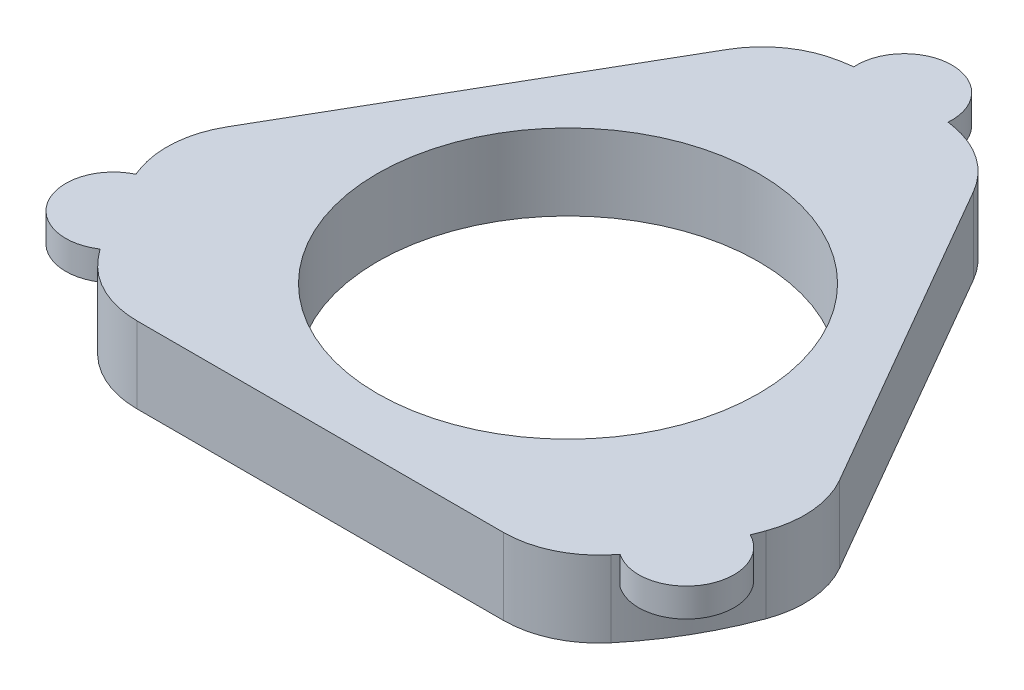
ISO-10303-21;
HEADER;
FILE_DESCRIPTION(('STEP AP214'),'2;1');
FILE_NAME('part.step','',(''),(''),'','','');
FILE_SCHEMA(('AUTOMOTIVE_DESIGN { 1 0 10303 214 1 1 1 1 }'));
ENDSEC;
DATA;
#1=APPLICATION_CONTEXT('core data for automotive mechanical design processes');
#2=APPLICATION_PROTOCOL_DEFINITION('international standard','automotive_design',2000,#1);
#3=PRODUCT_CONTEXT('',#1,'mechanical');
#4=PRODUCT('Part','Part','',(#3));
#5=PRODUCT_RELATED_PRODUCT_CATEGORY('part','',(#4));
#6=PRODUCT_DEFINITION_FORMATION('','',#4);
#7=PRODUCT_DEFINITION_CONTEXT('part definition',#1,'design');
#8=PRODUCT_DEFINITION('design','',#6,#7);
#9=PRODUCT_DEFINITION_SHAPE('','',#8);
#10=(LENGTH_UNIT() NAMED_UNIT(*) SI_UNIT(.MILLI.,.METRE.));
#11=(NAMED_UNIT(*) PLANE_ANGLE_UNIT() SI_UNIT($,.RADIAN.));
#12=(NAMED_UNIT(*) SI_UNIT($,.STERADIAN.) SOLID_ANGLE_UNIT());
#13=UNCERTAINTY_MEASURE_WITH_UNIT(LENGTH_MEASURE(1.E-05),#10,'distance_accuracy_value','');
#14=(GEOMETRIC_REPRESENTATION_CONTEXT(3) GLOBAL_UNCERTAINTY_ASSIGNED_CONTEXT((#13)) GLOBAL_UNIT_ASSIGNED_CONTEXT((#10,
#11,#12)) REPRESENTATION_CONTEXT('',''));
#15=CARTESIAN_POINT('',(0.,0.,0.));
#16=DIRECTION('',(0.,0.,1.));
#17=DIRECTION('',(1.,0.,0.));
#18=AXIS2_PLACEMENT_3D('',#15,#16,#17);
#19=CARTESIAN_POINT('',(0.,8.,0.));
#20=DIRECTION('',(0.,1.,0.));
#21=DIRECTION('',(0.,0.,1.));
#22=AXIS2_PLACEMENT_3D('',#19,#20,#21);
#23=PLANE('',#22);
#24=CARTESIAN_POINT('',(0.,8.,0.));
#25=DIRECTION('',(0.,1.,0.));
#26=DIRECTION('',(0.,0.,1.));
#27=AXIS2_PLACEMENT_3D('',#24,#25,#26);
#28=CIRCLE('',#27,20.);
#29=CARTESIAN_POINT('',(0.,8.,20.));
#30=VERTEX_POINT('',#29);
#31=EDGE_CURVE('E309',#30,#30,#28,.T.);
#32=ORIENTED_EDGE('',*,*,#31,.F.);
#33=EDGE_LOOP('',(#32));
#34=FACE_BOUND('',#33,.T.);
#35=CARTESIAN_POINT('',(0.,8.,0.));
#36=DIRECTION('',(0.,1.,0.));
#37=DIRECTION('',(0.,0.,1.));
#38=AXIS2_PLACEMENT_3D('',#35,#36,#37);
#39=CIRCLE('',#38,35.);
#40=CARTESIAN_POINT('',(-27.684829307094,8.,21.413785892202));
#41=VERTEX_POINT('',#40);
#42=CARTESIAN_POINT('',(-26.893121797218,8.,22.4));
#43=VERTEX_POINT('',#42);
#44=EDGE_CURVE('E168',#41,#43,#39,.T.);
#45=ORIENTED_EDGE('',*,*,#44,.T.);
#46=CARTESIAN_POINT('',(-19.2093727122986,8.,16.));
#47=DIRECTION('',(0.,1.,0.));
#48=DIRECTION('',(0.,0.,1.));
#49=AXIS2_PLACEMENT_3D('',#46,#47,#48);
#50=CIRCLE('',#49,10.);
#51=CARTESIAN_POINT('',(-19.2093727122985,8.,26.));
#52=VERTEX_POINT('',#51);
#53=EDGE_CURVE('E232',#43,#52,#50,.T.);
#54=ORIENTED_EDGE('',*,*,#53,.T.);
#55=DIRECTION('',(1.,0.,0.));
#56=VECTOR('',#55,1.);
#57=CARTESIAN_POINT('',(-45.0333209967908,8.,26.));
#58=LINE('',#57,#56);
#59=CARTESIAN_POINT('',(19.2093727122986,8.,26.));
#60=VERTEX_POINT('',#59);
#61=EDGE_CURVE('E195',#52,#60,#58,.T.);
#62=ORIENTED_EDGE('',*,*,#61,.T.);
#63=CARTESIAN_POINT('',(19.2093727122986,8.,16.));
#64=DIRECTION('',(0.,1.,0.));
#65=DIRECTION('',(0.,0.,1.));
#66=AXIS2_PLACEMENT_3D('',#63,#64,#65);
#67=CIRCLE('',#66,10.);
#68=CARTESIAN_POINT('',(26.893121797218,8.,22.4));
#69=VERTEX_POINT('',#68);
#70=EDGE_CURVE('E52',#60,#69,#67,.T.);
#71=ORIENTED_EDGE('',*,*,#70,.T.);
#72=CARTESIAN_POINT('',(27.3292743385288,8.,21.8657440790254));
#73=VERTEX_POINT('',#72);
#74=EDGE_CURVE('E159',#69,#73,#39,.T.);
#75=ORIENTED_EDGE('',*,*,#74,.T.);
#76=CARTESIAN_POINT('',(30.1661031621676,8.,17.7484145773493));
#77=DIRECTION('',(0.,1.,0.));
#78=DIRECTION('',(0.,0.,1.));
#79=AXIS2_PLACEMENT_3D('',#76,#77,#78);
#80=CIRCLE('',#79,5.);
#81=CARTESIAN_POINT('',(32.3872972273948,8.,13.2688725332783));
#82=VERTEX_POINT('',#81);
#83=EDGE_CURVE('E163',#73,#82,#80,.T.);
#84=ORIENTED_EDGE('',*,*,#83,.T.);
#85=CARTESIAN_POINT('',(32.8455299433804,8.,12.0901266634598));
#86=VERTEX_POINT('',#85);
#87=EDGE_CURVE('E169',#82,#86,#39,.T.);
#88=ORIENTED_EDGE('',*,*,#87,.T.);
#89=CARTESIAN_POINT('',(23.4610928167003,8.,8.63580475961414));
#90=DIRECTION('',(0.,1.,0.));
#91=DIRECTION('',(0.,0.,1.));
#92=AXIS2_PLACEMENT_3D('',#89,#90,#91);
#93=CIRCLE('',#92,10.);
#94=CARTESIAN_POINT('',(32.1213468545447,8.,3.63580475961415));
#95=VERTEX_POINT('',#94);
#96=EDGE_CURVE('E228',#86,#95,#93,.T.);
#97=ORIENTED_EDGE('',*,*,#96,.T.);
#98=DIRECTION('',(-0.5,0.,-0.866025403784439));
#99=VECTOR('',#98,1.);
#100=CARTESIAN_POINT('',(45.0333209967908,8.,26.));
#101=LINE('',#100,#99);
#102=CARTESIAN_POINT('',(12.9119741422461,8.,-29.6358047596141));
#103=VERTEX_POINT('',#102);
#104=EDGE_CURVE('E281',#95,#103,#101,.T.);
#105=ORIENTED_EDGE('',*,*,#104,.T.);
#106=CARTESIAN_POINT('',(4.25172010440174,8.,-24.6358047596141));
#107=DIRECTION('',(0.,1.,0.));
#108=DIRECTION('',(0.,0.,1.));
#109=AXIS2_PLACEMENT_3D('',#106,#107,#108);
#110=CIRCLE('',#109,10.);
#111=CARTESIAN_POINT('',(5.95240814616244,8.,-34.4901266634598));
#112=VERTEX_POINT('',#111);
#113=EDGE_CURVE('E226',#103,#112,#110,.T.);
#114=ORIENTED_EDGE('',*,*,#113,.T.);
#115=CARTESIAN_POINT('',(5.27165267582073,8.,-34.6007178836728));
#116=VERTEX_POINT('',#115);
#117=EDGE_CURVE('E171',#112,#116,#39,.T.);
#118=ORIENTED_EDGE('',*,*,#117,.T.);
#119=CARTESIAN_POINT('',(0.287526319798734,8.,-34.9988189602938));
#120=DIRECTION('',(0.,1.,0.));
#121=DIRECTION('',(0.,0.,1.));
#122=AXIS2_PLACEMENT_3D('',#119,#120,#121);
#123=CIRCLE('',#122,5.);
#124=CARTESIAN_POINT('',(-4.70246792030079,8.,-34.6826584254803));
#125=VERTEX_POINT('',#124);
#126=EDGE_CURVE('E264',#116,#125,#123,.T.);
#127=ORIENTED_EDGE('',*,*,#126,.T.);
#128=CARTESIAN_POINT('',(-5.95240814616245,8.,-34.4901266634598));
#129=VERTEX_POINT('',#128);
#130=EDGE_CURVE('E256',#125,#129,#39,.T.);
#131=ORIENTED_EDGE('',*,*,#130,.T.);
#132=CARTESIAN_POINT('',(-4.25172010440175,8.,-24.6358047596141));
#133=DIRECTION('',(0.,1.,0.));
#134=DIRECTION('',(0.,0.,1.));
#135=AXIS2_PLACEMENT_3D('',#132,#133,#134);
#136=CIRCLE('',#135,10.);
#137=CARTESIAN_POINT('',(-12.9119741422461,8.,-29.6358047596141));
#138=VERTEX_POINT('',#137);
#139=EDGE_CURVE('E224',#129,#138,#136,.T.);
#140=ORIENTED_EDGE('',*,*,#139,.T.);
#141=DIRECTION('',(-0.5,0.,0.866025403784439));
#142=VECTOR('',#141,1.);
#143=CARTESIAN_POINT('',(0.,8.,-52.));
#144=LINE('',#143,#142);
#145=CARTESIAN_POINT('',(-32.1213468545447,8.,3.63580475961414));
#146=VERTEX_POINT('',#145);
#147=EDGE_CURVE('E271',#138,#146,#144,.T.);
#148=ORIENTED_EDGE('',*,*,#147,.T.);
#149=CARTESIAN_POINT('',(-23.4610928167003,8.,8.63580475961414));
#150=DIRECTION('',(0.,1.,0.));
#151=DIRECTION('',(0.,0.,1.));
#152=AXIS2_PLACEMENT_3D('',#149,#150,#151);
#153=CIRCLE('',#152,10.);
#154=CARTESIAN_POINT('',(-32.8455299433804,8.,12.0901266634598));
#155=VERTEX_POINT('',#154);
#156=EDGE_CURVE('E60',#146,#155,#153,.T.);
#157=ORIENTED_EDGE('',*,*,#156,.T.);
#158=CARTESIAN_POINT('',(-32.6009270143495,8.,12.7349738046474));
#159=VERTEX_POINT('',#158);
#160=EDGE_CURVE('E266',#155,#159,#39,.T.);
#161=ORIENTED_EDGE('',*,*,#160,.T.);
#162=CARTESIAN_POINT('',(-30.4536294819663,8.,17.2504043829445));
#163=DIRECTION('',(0.,1.,0.));
#164=DIRECTION('',(0.,0.,1.));
#165=AXIS2_PLACEMENT_3D('',#162,#163,#164);
#166=CIRCLE('',#165,5.);
#167=EDGE_CURVE('E291',#159,#41,#166,.T.);
#168=ORIENTED_EDGE('',*,*,#167,.T.);
#169=EDGE_LOOP('',(#45,#54,#62,#71,#75,#84,#88,#97,#105,#114,#118,#127,#131,#140,#148,#157,#161,#168));
#170=FACE_BOUND('',#169,.T.);
#171=ADVANCED_FACE('F37',(#34,#170),#23,.T.);
#172=CARTESIAN_POINT('',(0.,8.,0.));
#173=DIRECTION('',(0.,-1.,0.));
#174=DIRECTION('',(0.,0.,-1.));
#175=AXIS2_PLACEMENT_3D('',#172,#173,#174);
#176=CYLINDRICAL_SURFACE('',#175,35.);
#177=ORIENTED_EDGE('',*,*,#74,.F.);
#178=DIRECTION('',(0.,-1.,0.));
#179=VECTOR('',#178,1.);
#180=CARTESIAN_POINT('',(26.893121797218,8.,22.4));
#181=LINE('',#180,#179);
#182=CARTESIAN_POINT('',(26.893121797218,0.,22.4));
#183=VERTEX_POINT('',#182);
#184=EDGE_CURVE('E241',#69,#183,#181,.T.);
#185=ORIENTED_EDGE('',*,*,#184,.T.);
#186=CARTESIAN_POINT('',(0.,0.,0.));
#187=DIRECTION('',(0.,1.,0.));
#188=DIRECTION('',(0.,0.,1.));
#189=AXIS2_PLACEMENT_3D('',#186,#187,#188);
#190=CIRCLE('',#189,35.);
#191=CARTESIAN_POINT('',(32.8455299433804,0.,12.0901266634598));
#192=VERTEX_POINT('',#191);
#193=EDGE_CURVE('E314',#183,#192,#190,.T.);
#194=ORIENTED_EDGE('',*,*,#193,.T.);
#195=DIRECTION('',(0.,-1.,0.));
#196=VECTOR('',#195,1.);
#197=CARTESIAN_POINT('',(32.8455299433804,8.,12.0901266634598));
#198=LINE('',#197,#196);
#199=EDGE_CURVE('E239',#192,#86,#198,.F.);
#200=ORIENTED_EDGE('',*,*,#199,.T.);
#201=ORIENTED_EDGE('',*,*,#87,.F.);
#202=DIRECTION('',(0.,1.,0.));
#203=VECTOR('',#202,1.);
#204=CARTESIAN_POINT('',(32.3872972273948,6.5,13.2688725332783));
#205=LINE('',#204,#203);
#206=CARTESIAN_POINT('',(32.3872972273948,5.,13.2688725332783));
#207=VERTEX_POINT('',#206);
#208=EDGE_CURVE('E178',#82,#207,#205,.F.);
#209=ORIENTED_EDGE('',*,*,#208,.T.);
#210=CARTESIAN_POINT('',(0.,5.,0.));
#211=DIRECTION('',(0.,1.,0.));
#212=DIRECTION('',(0.,0.,1.));
#213=AXIS2_PLACEMENT_3D('',#210,#211,#212);
#214=CIRCLE('',#213,35.);
#215=CARTESIAN_POINT('',(27.3292743385288,5.,21.8657440790254));
#216=VERTEX_POINT('',#215);
#217=EDGE_CURVE('E185',#216,#207,#214,.T.);
#218=ORIENTED_EDGE('',*,*,#217,.F.);
#219=DIRECTION('',(0.,1.,0.));
#220=VECTOR('',#219,1.);
#221=CARTESIAN_POINT('',(27.3292743385288,6.5,21.8657440790254));
#222=LINE('',#221,#220);
#223=EDGE_CURVE('E175',#216,#73,#222,.T.);
#224=ORIENTED_EDGE('',*,*,#223,.T.);
#225=EDGE_LOOP('',(#177,#185,#194,#200,#201,#209,#218,#224));
#226=FACE_BOUND('',#225,.T.);
#227=ADVANCED_FACE('F184',(#226),#176,.T.);
#228=ORIENTED_EDGE('',*,*,#117,.F.);
#229=DIRECTION('',(0.,-1.,0.));
#230=VECTOR('',#229,1.);
#231=CARTESIAN_POINT('',(5.95240814616244,8.,-34.4901266634598));
#232=LINE('',#231,#230);
#233=CARTESIAN_POINT('',(5.95240814616244,0.,-34.4901266634598));
#234=VERTEX_POINT('',#233);
#235=EDGE_CURVE('E11',#112,#234,#232,.T.);
#236=ORIENTED_EDGE('',*,*,#235,.T.);
#237=CARTESIAN_POINT('',(-5.95240814616245,0.,-34.4901266634598));
#238=VERTEX_POINT('',#237);
#239=EDGE_CURVE('E258',#234,#238,#190,.T.);
#240=ORIENTED_EDGE('',*,*,#239,.T.);
#241=DIRECTION('',(0.,-1.,0.));
#242=VECTOR('',#241,1.);
#243=CARTESIAN_POINT('',(-5.95240814616245,8.,-34.4901266634598));
#244=LINE('',#243,#242);
#245=EDGE_CURVE('E45',#238,#129,#244,.F.);
#246=ORIENTED_EDGE('',*,*,#245,.T.);
#247=ORIENTED_EDGE('',*,*,#130,.F.);
#248=DIRECTION('',(0.,1.,0.));
#249=VECTOR('',#248,1.);
#250=CARTESIAN_POINT('',(-4.70246792030079,6.5,-34.6826584254803));
#251=LINE('',#250,#249);
#252=CARTESIAN_POINT('',(-4.70246792030079,5.,-34.6826584254803));
#253=VERTEX_POINT('',#252);
#254=EDGE_CURVE('E330',#125,#253,#251,.F.);
#255=ORIENTED_EDGE('',*,*,#254,.T.);
#256=CARTESIAN_POINT('',(0.,5.,0.));
#257=DIRECTION('',(0.,1.,0.));
#258=DIRECTION('',(0.,0.,1.));
#259=AXIS2_PLACEMENT_3D('',#256,#257,#258);
#260=CIRCLE('',#259,35.);
#261=CARTESIAN_POINT('',(5.27165267582073,5.,-34.6007178836728));
#262=VERTEX_POINT('',#261);
#263=EDGE_CURVE('E328',#262,#253,#260,.T.);
#264=ORIENTED_EDGE('',*,*,#263,.F.);
#265=DIRECTION('',(0.,1.,0.));
#266=VECTOR('',#265,1.);
#267=CARTESIAN_POINT('',(5.27165267582073,6.5,-34.6007178836728));
#268=LINE('',#267,#266);
#269=EDGE_CURVE('E332',#262,#116,#268,.T.);
#270=ORIENTED_EDGE('',*,*,#269,.T.);
#271=EDGE_LOOP('',(#228,#236,#240,#246,#247,#255,#264,#270));
#272=FACE_BOUND('',#271,.T.);
#273=ADVANCED_FACE('F254',(#272),#176,.T.);
#274=CARTESIAN_POINT('',(-32.8455299433804,0.,12.0901266634598));
#275=VERTEX_POINT('',#274);
#276=CARTESIAN_POINT('',(-26.893121797218,0.,22.4));
#277=VERTEX_POINT('',#276);
#278=EDGE_CURVE('E278',#275,#277,#190,.T.);
#279=ORIENTED_EDGE('',*,*,#278,.T.);
#280=DIRECTION('',(0.,-1.,0.));
#281=VECTOR('',#280,1.);
#282=CARTESIAN_POINT('',(-26.893121797218,8.,22.4));
#283=LINE('',#282,#281);
#284=EDGE_CURVE('E222',#277,#43,#283,.F.);
#285=ORIENTED_EDGE('',*,*,#284,.T.);
#286=ORIENTED_EDGE('',*,*,#44,.F.);
#287=DIRECTION('',(0.,1.,0.));
#288=VECTOR('',#287,1.);
#289=CARTESIAN_POINT('',(-27.684829307094,6.5,21.413785892202));
#290=LINE('',#289,#288);
#291=CARTESIAN_POINT('',(-27.684829307094,5.,21.413785892202));
#292=VERTEX_POINT('',#291);
#293=EDGE_CURVE('E322',#41,#292,#290,.F.);
#294=ORIENTED_EDGE('',*,*,#293,.T.);
#295=CARTESIAN_POINT('',(0.,5.,0.));
#296=DIRECTION('',(0.,1.,0.));
#297=DIRECTION('',(0.,0.,1.));
#298=AXIS2_PLACEMENT_3D('',#295,#296,#297);
#299=CIRCLE('',#298,35.);
#300=CARTESIAN_POINT('',(-32.6009270143495,5.,12.7349738046474));
#301=VERTEX_POINT('',#300);
#302=EDGE_CURVE('E312',#301,#292,#299,.T.);
#303=ORIENTED_EDGE('',*,*,#302,.F.);
#304=DIRECTION('',(0.,1.,0.));
#305=VECTOR('',#304,1.);
#306=CARTESIAN_POINT('',(-32.6009270143495,6.5,12.7349738046474));
#307=LINE('',#306,#305);
#308=EDGE_CURVE('E325',#301,#159,#307,.T.);
#309=ORIENTED_EDGE('',*,*,#308,.T.);
#310=ORIENTED_EDGE('',*,*,#160,.F.);
#311=DIRECTION('',(0.,-1.,0.));
#312=VECTOR('',#311,1.);
#313=CARTESIAN_POINT('',(-32.8455299433804,8.,12.0901266634598));
#314=LINE('',#313,#312);
#315=EDGE_CURVE('E220',#155,#275,#314,.T.);
#316=ORIENTED_EDGE('',*,*,#315,.T.);
#317=EDGE_LOOP('',(#279,#285,#286,#294,#303,#309,#310,#316));
#318=FACE_BOUND('',#317,.T.);
#319=ADVANCED_FACE('F343',(#318),#176,.T.);
#320=CARTESIAN_POINT('',(0.,0.,0.));
#321=DIRECTION('',(0.,1.,0.));
#322=DIRECTION('',(0.,0.,1.));
#323=AXIS2_PLACEMENT_3D('',#320,#321,#322);
#324=PLANE('',#323);
#325=CARTESIAN_POINT('',(-25.1147367097487,0.,14.5));
#326=DIRECTION('',(0.,1.,0.));
#327=DIRECTION('',(0.,0.,1.));
#328=AXIS2_PLACEMENT_3D('',#325,#326,#327);
#329=CIRCLE('',#328,2.9);
#330=CARTESIAN_POINT('',(-25.1147367097487,0.,17.4));
#331=VERTEX_POINT('',#330);
#332=EDGE_CURVE('E308',#331,#331,#329,.T.);
#333=ORIENTED_EDGE('',*,*,#332,.T.);
#334=EDGE_LOOP('',(#333));
#335=FACE_BOUND('',#334,.T.);
#336=CARTESIAN_POINT('',(25.1147367097487,0.,14.5));
#337=DIRECTION('',(0.,1.,0.));
#338=DIRECTION('',(0.,0.,1.));
#339=AXIS2_PLACEMENT_3D('',#336,#337,#338);
#340=CIRCLE('',#339,2.9);
#341=CARTESIAN_POINT('',(25.1147367097487,0.,17.4));
#342=VERTEX_POINT('',#341);
#343=EDGE_CURVE('E304',#342,#342,#340,.T.);
#344=ORIENTED_EDGE('',*,*,#343,.T.);
#345=EDGE_LOOP('',(#344));
#346=FACE_BOUND('',#345,.T.);
#347=CARTESIAN_POINT('',(0.,0.,-29.));
#348=DIRECTION('',(0.,1.,0.));
#349=DIRECTION('',(0.,0.,1.));
#350=AXIS2_PLACEMENT_3D('',#347,#348,#349);
#351=CIRCLE('',#350,2.9);
#352=CARTESIAN_POINT('',(0.,0.,-26.1));
#353=VERTEX_POINT('',#352);
#354=EDGE_CURVE('E300',#353,#353,#351,.T.);
#355=ORIENTED_EDGE('',*,*,#354,.T.);
#356=EDGE_LOOP('',(#355));
#357=FACE_BOUND('',#356,.T.);
#358=CARTESIAN_POINT('',(0.,0.,0.));
#359=DIRECTION('',(0.,1.,0.));
#360=DIRECTION('',(0.,0.,1.));
#361=AXIS2_PLACEMENT_3D('',#358,#359,#360);
#362=CIRCLE('',#361,20.);
#363=CARTESIAN_POINT('',(0.,0.,20.));
#364=VERTEX_POINT('',#363);
#365=EDGE_CURVE('E181',#364,#364,#362,.T.);
#366=ORIENTED_EDGE('',*,*,#365,.T.);
#367=EDGE_LOOP('',(#366));
#368=FACE_BOUND('',#367,.T.);
#369=DIRECTION('',(1.,0.,0.));
#370=VECTOR('',#369,1.);
#371=CARTESIAN_POINT('',(0.,0.,26.));
#372=LINE('',#371,#370);
#373=CARTESIAN_POINT('',(-19.2093727122985,0.,26.));
#374=VERTEX_POINT('',#373);
#375=CARTESIAN_POINT('',(19.2093727122986,0.,26.));
#376=VERTEX_POINT('',#375);
#377=EDGE_CURVE('E189',#374,#376,#372,.T.);
#378=ORIENTED_EDGE('',*,*,#377,.F.);
#379=CARTESIAN_POINT('',(-19.2093727122986,0.,16.));
#380=DIRECTION('',(0.,1.,0.));
#381=DIRECTION('',(0.,0.,1.));
#382=AXIS2_PLACEMENT_3D('',#379,#380,#381);
#383=CIRCLE('',#382,10.);
#384=EDGE_CURVE('E218',#374,#277,#383,.F.);
#385=ORIENTED_EDGE('',*,*,#384,.T.);
#386=ORIENTED_EDGE('',*,*,#278,.F.);
#387=CARTESIAN_POINT('',(-23.4610928167003,0.,8.63580475961414));
#388=DIRECTION('',(0.,1.,0.));
#389=DIRECTION('',(0.,0.,1.));
#390=AXIS2_PLACEMENT_3D('',#387,#388,#389);
#391=CIRCLE('',#390,10.);
#392=CARTESIAN_POINT('',(-32.1213468545447,0.,3.63580475961414));
#393=VERTEX_POINT('',#392);
#394=EDGE_CURVE('E216',#275,#393,#391,.F.);
#395=ORIENTED_EDGE('',*,*,#394,.T.);
#396=DIRECTION('',(-0.5,0.,0.866025403784439));
#397=VECTOR('',#396,1.);
#398=CARTESIAN_POINT('',(-22.5166604983954,0.,-13.));
#399=LINE('',#398,#397);
#400=CARTESIAN_POINT('',(-12.9119741422461,0.,-29.6358047596141));
#401=VERTEX_POINT('',#400);
#402=EDGE_CURVE('E186',#401,#393,#399,.T.);
#403=ORIENTED_EDGE('',*,*,#402,.F.);
#404=CARTESIAN_POINT('',(-4.25172010440175,0.,-24.6358047596141));
#405=DIRECTION('',(0.,1.,0.));
#406=DIRECTION('',(0.,0.,1.));
#407=AXIS2_PLACEMENT_3D('',#404,#405,#406);
#408=CIRCLE('',#407,10.);
#409=EDGE_CURVE('E208',#401,#238,#408,.F.);
#410=ORIENTED_EDGE('',*,*,#409,.T.);
#411=ORIENTED_EDGE('',*,*,#239,.F.);
#412=CARTESIAN_POINT('',(4.25172010440174,0.,-24.6358047596141));
#413=DIRECTION('',(0.,1.,0.));
#414=DIRECTION('',(0.,0.,1.));
#415=AXIS2_PLACEMENT_3D('',#412,#413,#414);
#416=CIRCLE('',#415,10.);
#417=CARTESIAN_POINT('',(12.9119741422461,0.,-29.6358047596141));
#418=VERTEX_POINT('',#417);
#419=EDGE_CURVE('E210',#234,#418,#416,.F.);
#420=ORIENTED_EDGE('',*,*,#419,.T.);
#421=DIRECTION('',(-0.5,0.,-0.866025403784439));
#422=VECTOR('',#421,1.);
#423=CARTESIAN_POINT('',(22.5166604983954,0.,-13.));
#424=LINE('',#423,#422);
#425=CARTESIAN_POINT('',(32.1213468545447,0.,3.63580475961415));
#426=VERTEX_POINT('',#425);
#427=EDGE_CURVE('E199',#426,#418,#424,.T.);
#428=ORIENTED_EDGE('',*,*,#427,.F.);
#429=CARTESIAN_POINT('',(23.4610928167003,0.,8.63580475961414));
#430=DIRECTION('',(0.,1.,0.));
#431=DIRECTION('',(0.,0.,1.));
#432=AXIS2_PLACEMENT_3D('',#429,#430,#431);
#433=CIRCLE('',#432,10.);
#434=EDGE_CURVE('E212',#426,#192,#433,.F.);
#435=ORIENTED_EDGE('',*,*,#434,.T.);
#436=ORIENTED_EDGE('',*,*,#193,.F.);
#437=CARTESIAN_POINT('',(19.2093727122986,0.,16.));
#438=DIRECTION('',(0.,1.,0.));
#439=DIRECTION('',(0.,0.,1.));
#440=AXIS2_PLACEMENT_3D('',#437,#438,#439);
#441=CIRCLE('',#440,10.);
#442=EDGE_CURVE('E214',#183,#376,#441,.F.);
#443=ORIENTED_EDGE('',*,*,#442,.T.);
#444=EDGE_LOOP('',(#378,#385,#386,#395,#403,#410,#411,#420,#428,#435,#436,#443));
#445=FACE_BOUND('',#444,.T.);
#446=ADVANCED_FACE('F274',(#335,#346,#357,#368,#445),#324,.F.);
#447=CARTESIAN_POINT('',(0.,8.,0.));
#448=DIRECTION('',(0.,-1.,0.));
#449=DIRECTION('',(0.,0.,-1.));
#450=AXIS2_PLACEMENT_3D('',#447,#448,#449);
#451=CYLINDRICAL_SURFACE('',#450,20.);
#452=ORIENTED_EDGE('',*,*,#31,.T.);
#453=EDGE_LOOP('',(#452));
#454=FACE_BOUND('',#453,.T.);
#455=ORIENTED_EDGE('',*,*,#365,.F.);
#456=EDGE_LOOP('',(#455));
#457=FACE_BOUND('',#456,.T.);
#458=ADVANCED_FACE('F384',(#454,#457),#451,.F.);
#459=CARTESIAN_POINT('',(-25.1147367097487,-2.,14.5));
#460=DIRECTION('',(0.,-1.,0.));
#461=DIRECTION('',(0.,0.,-1.));
#462=AXIS2_PLACEMENT_3D('',#459,#460,#461);
#463=PLANE('',#462);
#464=CARTESIAN_POINT('',(-25.1147367097487,-2.,14.5));
#465=DIRECTION('',(0.,-1.,0.));
#466=DIRECTION('',(0.,0.,-1.));
#467=AXIS2_PLACEMENT_3D('',#464,#465,#466);
#468=CIRCLE('',#467,2.9);
#469=CARTESIAN_POINT('',(-25.1147367097487,-2.,11.6));
#470=VERTEX_POINT('',#469);
#471=EDGE_CURVE('E305',#470,#470,#468,.T.);
#472=ORIENTED_EDGE('',*,*,#471,.T.);
#473=EDGE_LOOP('',(#472));
#474=FACE_BOUND('',#473,.T.);
#475=ADVANCED_FACE('F427',(#474),#463,.T.);
#476=CARTESIAN_POINT('',(-25.1147367097487,16.2024386617639,14.5));
#477=DIRECTION('',(0.,-1.,0.));
#478=DIRECTION('',(0.,0.,-1.));
#479=AXIS2_PLACEMENT_3D('',#476,#477,#478);
#480=CYLINDRICAL_SURFACE('',#479,2.9);
#481=ORIENTED_EDGE('',*,*,#471,.F.);
#482=EDGE_LOOP('',(#481));
#483=FACE_BOUND('',#482,.T.);
#484=ORIENTED_EDGE('',*,*,#332,.F.);
#485=EDGE_LOOP('',(#484));
#486=FACE_BOUND('',#485,.T.);
#487=ADVANCED_FACE('F440',(#483,#486),#480,.T.);
#488=CARTESIAN_POINT('',(25.1147367097487,-2.,14.5));
#489=DIRECTION('',(0.,-1.,0.));
#490=DIRECTION('',(0.,0.,-1.));
#491=AXIS2_PLACEMENT_3D('',#488,#489,#490);
#492=PLANE('',#491);
#493=CARTESIAN_POINT('',(25.1147367097487,-2.,14.5));
#494=DIRECTION('',(0.,-1.,0.));
#495=DIRECTION('',(0.,0.,-1.));
#496=AXIS2_PLACEMENT_3D('',#493,#494,#495);
#497=CIRCLE('',#496,2.9);
#498=CARTESIAN_POINT('',(25.1147367097487,-2.,11.6));
#499=VERTEX_POINT('',#498);
#500=EDGE_CURVE('E301',#499,#499,#497,.T.);
#501=ORIENTED_EDGE('',*,*,#500,.T.);
#502=EDGE_LOOP('',(#501));
#503=FACE_BOUND('',#502,.T.);
#504=ADVANCED_FACE('F448',(#503),#492,.T.);
#505=CARTESIAN_POINT('',(25.1147367097487,16.2024386617639,14.5));
#506=DIRECTION('',(0.,-1.,0.));
#507=DIRECTION('',(0.,0.,-1.));
#508=AXIS2_PLACEMENT_3D('',#505,#506,#507);
#509=CYLINDRICAL_SURFACE('',#508,2.9);
#510=ORIENTED_EDGE('',*,*,#500,.F.);
#511=EDGE_LOOP('',(#510));
#512=FACE_BOUND('',#511,.T.);
#513=ORIENTED_EDGE('',*,*,#343,.F.);
#514=EDGE_LOOP('',(#513));
#515=FACE_BOUND('',#514,.T.);
#516=ADVANCED_FACE('F455',(#512,#515),#509,.T.);
#517=CARTESIAN_POINT('',(0.,-2.,-29.));
#518=DIRECTION('',(0.,-1.,0.));
#519=DIRECTION('',(0.,0.,-1.));
#520=AXIS2_PLACEMENT_3D('',#517,#518,#519);
#521=PLANE('',#520);
#522=CARTESIAN_POINT('',(0.,-2.,-29.));
#523=DIRECTION('',(0.,-1.,0.));
#524=DIRECTION('',(0.,0.,-1.));
#525=AXIS2_PLACEMENT_3D('',#522,#523,#524);
#526=CIRCLE('',#525,2.9);
#527=CARTESIAN_POINT('',(0.,-2.,-31.9));
#528=VERTEX_POINT('',#527);
#529=EDGE_CURVE('E296',#528,#528,#526,.T.);
#530=ORIENTED_EDGE('',*,*,#529,.T.);
#531=EDGE_LOOP('',(#530));
#532=FACE_BOUND('',#531,.T.);
#533=ADVANCED_FACE('F463',(#532),#521,.T.);
#534=CARTESIAN_POINT('',(0.,16.2024386617639,-29.));
#535=DIRECTION('',(0.,-1.,0.));
#536=DIRECTION('',(0.,0.,-1.));
#537=AXIS2_PLACEMENT_3D('',#534,#535,#536);
#538=CYLINDRICAL_SURFACE('',#537,2.9);
#539=ORIENTED_EDGE('',*,*,#529,.F.);
#540=EDGE_LOOP('',(#539));
#541=FACE_BOUND('',#540,.T.);
#542=ORIENTED_EDGE('',*,*,#354,.F.);
#543=EDGE_LOOP('',(#542));
#544=FACE_BOUND('',#543,.T.);
#545=ADVANCED_FACE('F471',(#541,#544),#538,.T.);
#546=CARTESIAN_POINT('',(-30.4536294819663,5.,17.2504043829445));
#547=DIRECTION('',(0.,1.,0.));
#548=DIRECTION('',(0.,0.,1.));
#549=AXIS2_PLACEMENT_3D('',#546,#547,#548);
#550=CYLINDRICAL_SURFACE('',#549,5.);
#551=ORIENTED_EDGE('',*,*,#308,.F.);
#552=CARTESIAN_POINT('',(-30.4536294819663,5.,17.2504043829445));
#553=DIRECTION('',(0.,1.,0.));
#554=DIRECTION('',(0.,0.,1.));
#555=AXIS2_PLACEMENT_3D('',#552,#553,#554);
#556=CIRCLE('',#555,5.);
#557=EDGE_CURVE('E293',#301,#292,#556,.T.);
#558=ORIENTED_EDGE('',*,*,#557,.T.);
#559=ORIENTED_EDGE('',*,*,#293,.F.);
#560=ORIENTED_EDGE('',*,*,#167,.F.);
#561=EDGE_LOOP('',(#551,#558,#559,#560));
#562=FACE_BOUND('',#561,.T.);
#563=ADVANCED_FACE('F479',(#562),#550,.T.);
#564=CARTESIAN_POINT('',(-30.4536294819663,5.,17.2504043829445));
#565=DIRECTION('',(0.,1.,0.));
#566=DIRECTION('',(0.,0.,1.));
#567=AXIS2_PLACEMENT_3D('',#564,#565,#566);
#568=PLANE('',#567);
#569=ORIENTED_EDGE('',*,*,#557,.F.);
#570=ORIENTED_EDGE('',*,*,#302,.T.);
#571=EDGE_LOOP('',(#569,#570));
#572=FACE_BOUND('',#571,.T.);
#573=ADVANCED_FACE('F487',(#572),#568,.F.);
#574=CARTESIAN_POINT('',(0.287526319798734,5.,-34.9988189602938));
#575=DIRECTION('',(0.,1.,0.));
#576=DIRECTION('',(0.,0.,1.));
#577=AXIS2_PLACEMENT_3D('',#574,#575,#576);
#578=CYLINDRICAL_SURFACE('',#577,5.);
#579=ORIENTED_EDGE('',*,*,#269,.F.);
#580=CARTESIAN_POINT('',(0.287526319798734,5.,-34.9988189602938));
#581=DIRECTION('',(0.,1.,0.));
#582=DIRECTION('',(0.,0.,1.));
#583=AXIS2_PLACEMENT_3D('',#580,#581,#582);
#584=CIRCLE('',#583,5.);
#585=EDGE_CURVE('E288',#262,#253,#584,.T.);
#586=ORIENTED_EDGE('',*,*,#585,.T.);
#587=ORIENTED_EDGE('',*,*,#254,.F.);
#588=ORIENTED_EDGE('',*,*,#126,.F.);
#589=EDGE_LOOP('',(#579,#586,#587,#588));
#590=FACE_BOUND('',#589,.T.);
#591=ADVANCED_FACE('F495',(#590),#578,.T.);
#592=CARTESIAN_POINT('',(0.287526319798734,5.,-34.9988189602938));
#593=DIRECTION('',(0.,1.,0.));
#594=DIRECTION('',(0.,0.,1.));
#595=AXIS2_PLACEMENT_3D('',#592,#593,#594);
#596=PLANE('',#595);
#597=ORIENTED_EDGE('',*,*,#585,.F.);
#598=ORIENTED_EDGE('',*,*,#263,.T.);
#599=EDGE_LOOP('',(#597,#598));
#600=FACE_BOUND('',#599,.T.);
#601=ADVANCED_FACE('F503',(#600),#596,.F.);
#602=CARTESIAN_POINT('',(30.1661031621676,5.,17.7484145773493));
#603=DIRECTION('',(0.,1.,0.));
#604=DIRECTION('',(0.,0.,1.));
#605=AXIS2_PLACEMENT_3D('',#602,#603,#604);
#606=CYLINDRICAL_SURFACE('',#605,5.);
#607=ORIENTED_EDGE('',*,*,#223,.F.);
#608=CARTESIAN_POINT('',(30.1661031621676,5.,17.7484145773493));
#609=DIRECTION('',(0.,1.,0.));
#610=DIRECTION('',(0.,0.,1.));
#611=AXIS2_PLACEMENT_3D('',#608,#609,#610);
#612=CIRCLE('',#611,5.);
#613=EDGE_CURVE('E180',#216,#207,#612,.T.);
#614=ORIENTED_EDGE('',*,*,#613,.T.);
#615=ORIENTED_EDGE('',*,*,#208,.F.);
#616=ORIENTED_EDGE('',*,*,#83,.F.);
#617=EDGE_LOOP('',(#607,#614,#615,#616));
#618=FACE_BOUND('',#617,.T.);
#619=ADVANCED_FACE('F173',(#618),#606,.T.);
#620=CARTESIAN_POINT('',(30.1661031621676,5.,17.7484145773493));
#621=DIRECTION('',(0.,1.,0.));
#622=DIRECTION('',(0.,0.,1.));
#623=AXIS2_PLACEMENT_3D('',#620,#621,#622);
#624=PLANE('',#623);
#625=ORIENTED_EDGE('',*,*,#613,.F.);
#626=ORIENTED_EDGE('',*,*,#217,.T.);
#627=EDGE_LOOP('',(#625,#626));
#628=FACE_BOUND('',#627,.T.);
#629=ADVANCED_FACE('F335',(#628),#624,.F.);
#630=CARTESIAN_POINT('',(0.,-14.,-52.));
#631=DIRECTION('',(-0.866025403784439,0.,-0.5));
#632=DIRECTION('',(-0.5,0.,0.866025403784439));
#633=AXIS2_PLACEMENT_3D('',#630,#631,#632);
#634=PLANE('',#633);
#635=ORIENTED_EDGE('',*,*,#402,.T.);
#636=DIRECTION('',(0.,1.,0.));
#637=VECTOR('',#636,1.);
#638=CARTESIAN_POINT('',(-32.1213468545447,8.,3.63580475961414));
#639=LINE('',#638,#637);
#640=EDGE_CURVE('E237',#393,#146,#639,.T.);
#641=ORIENTED_EDGE('',*,*,#640,.T.);
#642=ORIENTED_EDGE('',*,*,#147,.F.);
#643=DIRECTION('',(0.,1.,0.));
#644=VECTOR('',#643,1.);
#645=CARTESIAN_POINT('',(-12.9119741422461,0.,-29.6358047596141));
#646=LINE('',#645,#644);
#647=EDGE_CURVE('E234',#138,#401,#646,.F.);
#648=ORIENTED_EDGE('',*,*,#647,.T.);
#649=EDGE_LOOP('',(#635,#641,#642,#648));
#650=FACE_BOUND('',#649,.T.);
#651=ADVANCED_FACE('F270',(#650),#634,.T.);
#652=CARTESIAN_POINT('',(-45.0333209967908,-14.,26.));
#653=DIRECTION('',(0.,0.,1.));
#654=DIRECTION('',(1.,0.,0.));
#655=AXIS2_PLACEMENT_3D('',#652,#653,#654);
#656=PLANE('',#655);
#657=ORIENTED_EDGE('',*,*,#61,.F.);
#658=DIRECTION('',(0.,1.,0.));
#659=VECTOR('',#658,1.);
#660=CARTESIAN_POINT('',(-19.2093727122985,0.,26.));
#661=LINE('',#660,#659);
#662=EDGE_CURVE('E205',#52,#374,#661,.F.);
#663=ORIENTED_EDGE('',*,*,#662,.T.);
#664=ORIENTED_EDGE('',*,*,#377,.T.);
#665=DIRECTION('',(0.,1.,0.));
#666=VECTOR('',#665,1.);
#667=CARTESIAN_POINT('',(19.2093727122986,8.,26.));
#668=LINE('',#667,#666);
#669=EDGE_CURVE('E202',#376,#60,#668,.T.);
#670=ORIENTED_EDGE('',*,*,#669,.T.);
#671=EDGE_LOOP('',(#657,#663,#664,#670));
#672=FACE_BOUND('',#671,.T.);
#673=ADVANCED_FACE('F351',(#672),#656,.T.);
#674=CARTESIAN_POINT('',(45.0333209967908,-14.,26.));
#675=DIRECTION('',(0.866025403784439,0.,-0.5));
#676=DIRECTION('',(-0.5,0.,-0.866025403784439));
#677=AXIS2_PLACEMENT_3D('',#674,#675,#676);
#678=PLANE('',#677);
#679=ORIENTED_EDGE('',*,*,#104,.F.);
#680=DIRECTION('',(0.,1.,0.));
#681=VECTOR('',#680,1.);
#682=CARTESIAN_POINT('',(32.1213468545447,0.,3.63580475961415));
#683=LINE('',#682,#681);
#684=EDGE_CURVE('E246',#95,#426,#683,.F.);
#685=ORIENTED_EDGE('',*,*,#684,.T.);
#686=ORIENTED_EDGE('',*,*,#427,.T.);
#687=DIRECTION('',(0.,1.,0.));
#688=VECTOR('',#687,1.);
#689=CARTESIAN_POINT('',(12.9119741422461,8.,-29.6358047596141));
#690=LINE('',#689,#688);
#691=EDGE_CURVE('E243',#418,#103,#690,.T.);
#692=ORIENTED_EDGE('',*,*,#691,.T.);
#693=EDGE_LOOP('',(#679,#685,#686,#692));
#694=FACE_BOUND('',#693,.T.);
#695=ADVANCED_FACE('F362',(#694),#678,.T.);
#696=CARTESIAN_POINT('',(-19.2093727122986,8.,16.));
#697=DIRECTION('',(0.,-1.,0.));
#698=DIRECTION('',(0.,0.,-1.));
#699=AXIS2_PLACEMENT_3D('',#696,#697,#698);
#700=CYLINDRICAL_SURFACE('',#699,10.);
#701=ORIENTED_EDGE('',*,*,#53,.F.);
#702=ORIENTED_EDGE('',*,*,#284,.F.);
#703=ORIENTED_EDGE('',*,*,#384,.F.);
#704=ORIENTED_EDGE('',*,*,#662,.F.);
#705=EDGE_LOOP('',(#701,#702,#703,#704));
#706=FACE_BOUND('',#705,.T.);
#707=ADVANCED_FACE('F347',(#706),#700,.T.);
#708=CARTESIAN_POINT('',(-23.4610928167003,8.,8.63580475961414));
#709=DIRECTION('',(0.,-1.,0.));
#710=DIRECTION('',(0.,0.,-1.));
#711=AXIS2_PLACEMENT_3D('',#708,#709,#710);
#712=CYLINDRICAL_SURFACE('',#711,10.);
#713=ORIENTED_EDGE('',*,*,#394,.F.);
#714=ORIENTED_EDGE('',*,*,#315,.F.);
#715=ORIENTED_EDGE('',*,*,#156,.F.);
#716=ORIENTED_EDGE('',*,*,#640,.F.);
#717=EDGE_LOOP('',(#713,#714,#715,#716));
#718=FACE_BOUND('',#717,.T.);
#719=ADVANCED_FACE('F279',(#718),#712,.T.);
#720=CARTESIAN_POINT('',(19.2093727122986,8.,16.));
#721=DIRECTION('',(0.,-1.,0.));
#722=DIRECTION('',(0.,0.,-1.));
#723=AXIS2_PLACEMENT_3D('',#720,#721,#722);
#724=CYLINDRICAL_SURFACE('',#723,10.);
#725=ORIENTED_EDGE('',*,*,#442,.F.);
#726=ORIENTED_EDGE('',*,*,#184,.F.);
#727=ORIENTED_EDGE('',*,*,#70,.F.);
#728=ORIENTED_EDGE('',*,*,#669,.F.);
#729=EDGE_LOOP('',(#725,#726,#727,#728));
#730=FACE_BOUND('',#729,.T.);
#731=ADVANCED_FACE('F355',(#730),#724,.T.);
#732=CARTESIAN_POINT('',(23.4610928167003,8.,8.63580475961414));
#733=DIRECTION('',(0.,-1.,0.));
#734=DIRECTION('',(0.,0.,-1.));
#735=AXIS2_PLACEMENT_3D('',#732,#733,#734);
#736=CYLINDRICAL_SURFACE('',#735,10.);
#737=ORIENTED_EDGE('',*,*,#96,.F.);
#738=ORIENTED_EDGE('',*,*,#199,.F.);
#739=ORIENTED_EDGE('',*,*,#434,.F.);
#740=ORIENTED_EDGE('',*,*,#684,.F.);
#741=EDGE_LOOP('',(#737,#738,#739,#740));
#742=FACE_BOUND('',#741,.T.);
#743=ADVANCED_FACE('F359',(#742),#736,.T.);
#744=CARTESIAN_POINT('',(4.25172010440174,8.,-24.6358047596141));
#745=DIRECTION('',(0.,-1.,0.));
#746=DIRECTION('',(0.,0.,-1.));
#747=AXIS2_PLACEMENT_3D('',#744,#745,#746);
#748=CYLINDRICAL_SURFACE('',#747,10.);
#749=ORIENTED_EDGE('',*,*,#419,.F.);
#750=ORIENTED_EDGE('',*,*,#235,.F.);
#751=ORIENTED_EDGE('',*,*,#113,.F.);
#752=ORIENTED_EDGE('',*,*,#691,.F.);
#753=EDGE_LOOP('',(#749,#750,#751,#752));
#754=FACE_BOUND('',#753,.T.);
#755=ADVANCED_FACE('F368',(#754),#748,.T.);
#756=CARTESIAN_POINT('',(-4.25172010440175,8.,-24.6358047596141));
#757=DIRECTION('',(0.,-1.,0.));
#758=DIRECTION('',(0.,0.,-1.));
#759=AXIS2_PLACEMENT_3D('',#756,#757,#758);
#760=CYLINDRICAL_SURFACE('',#759,10.);
#761=ORIENTED_EDGE('',*,*,#139,.F.);
#762=ORIENTED_EDGE('',*,*,#245,.F.);
#763=ORIENTED_EDGE('',*,*,#409,.F.);
#764=ORIENTED_EDGE('',*,*,#647,.F.);
#765=EDGE_LOOP('',(#761,#762,#763,#764));
#766=FACE_BOUND('',#765,.T.);
#767=ADVANCED_FACE('F39',(#766),#760,.T.);
#768=CLOSED_SHELL('',(#171,#227,#273,#319,#446,#458,#475,#487,#504,#516,#533,#545,#563,#573,
#591,#601,#619,#629,#651,#673,#695,#707,#719,#731,#743,#755,#767));
#769=MANIFOLD_SOLID_BREP('B2',#768);
#770=ADVANCED_BREP_SHAPE_REPRESENTATION('',(#18,#769),#14);
#771=SHAPE_DEFINITION_REPRESENTATION(#9,#770);
ENDSEC;
END-ISO-10303-21;
